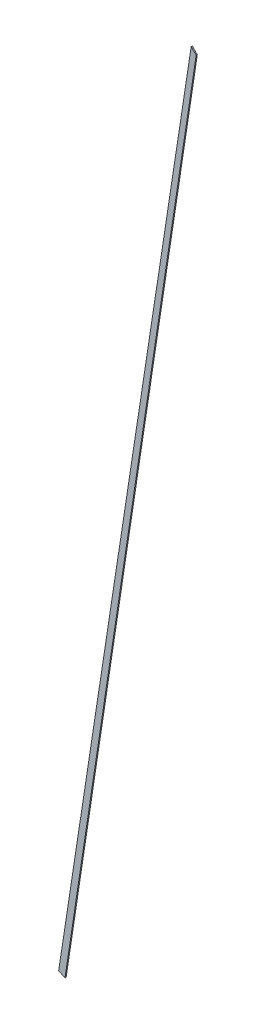
ISO-10303-21;
HEADER;
FILE_DESCRIPTION(('STEP AP214'),'2;1');
FILE_NAME('part.step','',(''),(''),'','','');
FILE_SCHEMA(('AUTOMOTIVE_DESIGN { 1 0 10303 214 1 1 1 1 }'));
ENDSEC;
DATA;
#1=APPLICATION_CONTEXT('core data for automotive mechanical design processes');
#2=APPLICATION_PROTOCOL_DEFINITION('international standard','automotive_design',2000,#1);
#3=PRODUCT_CONTEXT('',#1,'mechanical');
#4=PRODUCT('Part','Part','',(#3));
#5=PRODUCT_RELATED_PRODUCT_CATEGORY('part','',(#4));
#6=PRODUCT_DEFINITION_FORMATION('','',#4);
#7=PRODUCT_DEFINITION_CONTEXT('part definition',#1,'design');
#8=PRODUCT_DEFINITION('design','',#6,#7);
#9=PRODUCT_DEFINITION_SHAPE('','',#8);
#10=(LENGTH_UNIT() NAMED_UNIT(*) SI_UNIT(.MILLI.,.METRE.));
#11=(NAMED_UNIT(*) PLANE_ANGLE_UNIT() SI_UNIT($,.RADIAN.));
#12=(NAMED_UNIT(*) SI_UNIT($,.STERADIAN.) SOLID_ANGLE_UNIT());
#13=UNCERTAINTY_MEASURE_WITH_UNIT(LENGTH_MEASURE(1.E-05),#10,'distance_accuracy_value','');
#14=(GEOMETRIC_REPRESENTATION_CONTEXT(3) GLOBAL_UNCERTAINTY_ASSIGNED_CONTEXT((#13)) GLOBAL_UNIT_ASSIGNED_CONTEXT((#10,
#11,#12)) REPRESENTATION_CONTEXT('',''));
#15=CARTESIAN_POINT('',(0.,0.,0.));
#16=DIRECTION('',(0.,0.,1.));
#17=DIRECTION('',(1.,0.,0.));
#18=AXIS2_PLACEMENT_3D('',#15,#16,#17);
#19=CARTESIAN_POINT('',(917.615369088428,917.615369088428,3.175));
#20=DIRECTION('',(-0.707106781186548,-0.707106781186548,0.));
#21=DIRECTION('',(0.707106781186548,-0.707106781186548,0.));
#22=AXIS2_PLACEMENT_3D('',#19,#20,#21);
#23=PLANE('',#22);
#24=DIRECTION('',(-0.707106781186548,0.707106781186548,0.));
#25=VECTOR('',#24,1.);
#26=CARTESIAN_POINT('',(917.615369088428,917.615369088428,0.));
#27=LINE('',#26,#25);
#28=CARTESIAN_POINT('',(67.2588104402783,1767.97192773658,0.));
#29=VERTEX_POINT('',#28);
#30=CARTESIAN_POINT('',(53.7884262586746,1781.44231191818,0.));
#31=VERTEX_POINT('',#30);
#32=EDGE_CURVE('E98',#29,#31,#27,.T.);
#33=ORIENTED_EDGE('',*,*,#32,.T.);
#34=DIRECTION('',(0.,0.,-1.));
#35=VECTOR('',#34,1.);
#36=CARTESIAN_POINT('',(53.7884262586746,1781.44231191818,3.175));
#37=LINE('',#36,#35);
#38=CARTESIAN_POINT('',(53.7884262586746,1781.44231191818,3.175));
#39=VERTEX_POINT('',#38);
#40=EDGE_CURVE('E11',#39,#31,#37,.T.);
#41=ORIENTED_EDGE('',*,*,#40,.F.);
#42=DIRECTION('',(-0.707106781186548,0.707106781186548,0.));
#43=VECTOR('',#42,1.);
#44=CARTESIAN_POINT('',(917.615369088428,917.615369088428,3.175));
#45=LINE('',#44,#43);
#46=CARTESIAN_POINT('',(67.2588104402783,1767.97192773658,3.175));
#47=VERTEX_POINT('',#46);
#48=EDGE_CURVE('E86',#47,#39,#45,.T.);
#49=ORIENTED_EDGE('',*,*,#48,.F.);
#50=DIRECTION('',(0.,0.,-1.));
#51=VECTOR('',#50,1.);
#52=CARTESIAN_POINT('',(67.2588104402783,1767.97192773658,3.175));
#53=LINE('',#52,#51);
#54=EDGE_CURVE('E94',#47,#29,#53,.T.);
#55=ORIENTED_EDGE('',*,*,#54,.T.);
#56=EDGE_LOOP('',(#33,#41,#49,#55));
#57=FACE_BOUND('',#56,.T.);
#58=ADVANCED_FACE('F35',(#57),#23,.F.);
#59=CARTESIAN_POINT('',(-213.628632397325,32.667406388178,3.175));
#60=DIRECTION('',(0.988509357300365,-0.1511596855303,0.));
#61=DIRECTION('',(0.1511596855303,0.988509357300365,0.));
#62=AXIS2_PLACEMENT_3D('',#59,#60,#61);
#63=PLANE('',#62);
#64=DIRECTION('',(-0.1511596855303,-0.988509357300365,0.));
#65=VECTOR('',#64,1.);
#66=CARTESIAN_POINT('',(-213.628632397325,32.667406388178,0.));
#67=LINE('',#66,#65);
#68=CARTESIAN_POINT('',(-304.535503681059,-561.818435465854,0.));
#69=VERTEX_POINT('',#68);
#70=EDGE_CURVE('E90',#31,#69,#67,.T.);
#71=ORIENTED_EDGE('',*,*,#70,.T.);
#72=DIRECTION('',(0.,0.,-1.));
#73=VECTOR('',#72,1.);
#74=CARTESIAN_POINT('',(-304.535503681059,-561.818435465854,3.175));
#75=LINE('',#74,#73);
#76=CARTESIAN_POINT('',(-304.535503681059,-561.818435465854,3.175));
#77=VERTEX_POINT('',#76);
#78=EDGE_CURVE('E43',#77,#69,#75,.T.);
#79=ORIENTED_EDGE('',*,*,#78,.F.);
#80=DIRECTION('',(-0.1511596855303,-0.988509357300365,0.));
#81=VECTOR('',#80,1.);
#82=CARTESIAN_POINT('',(-213.628632397325,32.667406388178,3.175));
#83=LINE('',#82,#81);
#84=EDGE_CURVE('E81',#39,#77,#83,.T.);
#85=ORIENTED_EDGE('',*,*,#84,.F.);
#86=ORIENTED_EDGE('',*,*,#40,.T.);
#87=EDGE_LOOP('',(#71,#79,#85,#86));
#88=FACE_BOUND('',#87,.T.);
#89=ADVANCED_FACE('F89',(#88),#63,.F.);
#90=CARTESIAN_POINT('',(-284.321387199017,-571.868483346692,3.175));
#91=DIRECTION('',(0.445192120904195,0.895435076085824,0.));
#92=DIRECTION('',(-0.895435076085824,0.445192120904195,0.));
#93=AXIS2_PLACEMENT_3D('',#90,#91,#92);
#94=PLANE('',#93);
#95=DIRECTION('',(0.895435076085824,-0.445192120904195,0.));
#96=VECTOR('',#95,1.);
#97=CARTESIAN_POINT('',(-284.321387199017,-571.868483346692,0.));
#98=LINE('',#97,#96);
#99=CARTESIAN_POINT('',(-287.477465481624,-570.299345369079,0.));
#100=VERTEX_POINT('',#99);
#101=EDGE_CURVE('E68',#69,#100,#98,.T.);
#102=ORIENTED_EDGE('',*,*,#101,.T.);
#103=DIRECTION('',(0.,0.,-1.));
#104=VECTOR('',#103,1.);
#105=CARTESIAN_POINT('',(-287.477465481624,-570.299345369079,3.175));
#106=LINE('',#105,#104);
#107=CARTESIAN_POINT('',(-287.477465481624,-570.299345369079,3.175));
#108=VERTEX_POINT('',#107);
#109=EDGE_CURVE('E91',#108,#100,#106,.T.);
#110=ORIENTED_EDGE('',*,*,#109,.F.);
#111=DIRECTION('',(0.895435076085824,-0.445192120904195,0.));
#112=VECTOR('',#111,1.);
#113=CARTESIAN_POINT('',(-284.321387199017,-571.868483346692,3.175));
#114=LINE('',#113,#112);
#115=EDGE_CURVE('E84',#77,#108,#114,.T.);
#116=ORIENTED_EDGE('',*,*,#115,.F.);
#117=ORIENTED_EDGE('',*,*,#78,.T.);
#118=EDGE_LOOP('',(#102,#110,#116,#117));
#119=FACE_BOUND('',#118,.T.);
#120=ADVANCED_FACE('F92',(#119),#94,.F.);
#121=CARTESIAN_POINT('',(-196.436944157253,29.8012086216457,3.175));
#122=DIRECTION('',(-0.988687132085346,0.149992515976145,0.));
#123=DIRECTION('',(-0.149992515976145,-0.988687132085346,0.));
#124=AXIS2_PLACEMENT_3D('',#121,#122,#123);
#125=PLANE('',#124);
#126=DIRECTION('',(0.149992515976145,0.988687132085346,0.));
#127=VECTOR('',#126,1.);
#128=CARTESIAN_POINT('',(-196.436944157253,29.8012086216457,0.));
#129=LINE('',#128,#127);
#130=EDGE_CURVE('E74',#100,#29,#129,.T.);
#131=ORIENTED_EDGE('',*,*,#130,.T.);
#132=ORIENTED_EDGE('',*,*,#54,.F.);
#133=DIRECTION('',(0.149992515976145,0.988687132085346,0.));
#134=VECTOR('',#133,1.);
#135=CARTESIAN_POINT('',(-196.436944157253,29.8012086216457,3.175));
#136=LINE('',#135,#134);
#137=EDGE_CURVE('E51',#108,#47,#136,.T.);
#138=ORIENTED_EDGE('',*,*,#137,.F.);
#139=ORIENTED_EDGE('',*,*,#109,.T.);
#140=EDGE_LOOP('',(#131,#132,#138,#139));
#141=FACE_BOUND('',#140,.T.);
#142=ADVANCED_FACE('F105',(#141),#125,.F.);
#143=CARTESIAN_POINT('',(0.,0.,3.175));
#144=DIRECTION('',(0.,0.,1.));
#145=DIRECTION('',(1.,0.,0.));
#146=AXIS2_PLACEMENT_3D('',#143,#144,#145);
#147=PLANE('',#146);
#148=ORIENTED_EDGE('',*,*,#48,.T.);
#149=ORIENTED_EDGE('',*,*,#84,.T.);
#150=ORIENTED_EDGE('',*,*,#115,.T.);
#151=ORIENTED_EDGE('',*,*,#137,.T.);
#152=EDGE_LOOP('',(#148,#149,#150,#151));
#153=FACE_BOUND('',#152,.T.);
#154=ADVANCED_FACE('F82',(#153),#147,.T.);
#155=CARTESIAN_POINT('',(0.,0.,0.));
#156=DIRECTION('',(0.,0.,1.));
#157=DIRECTION('',(1.,0.,0.));
#158=AXIS2_PLACEMENT_3D('',#155,#156,#157);
#159=PLANE('',#158);
#160=ORIENTED_EDGE('',*,*,#32,.F.);
#161=ORIENTED_EDGE('',*,*,#130,.F.);
#162=ORIENTED_EDGE('',*,*,#101,.F.);
#163=ORIENTED_EDGE('',*,*,#70,.F.);
#164=EDGE_LOOP('',(#160,#161,#162,#163));
#165=FACE_BOUND('',#164,.T.);
#166=ADVANCED_FACE('F108',(#165),#159,.F.);
#167=CLOSED_SHELL('',(#58,#89,#120,#142,#154,#166));
#168=MANIFOLD_SOLID_BREP('B2',#167);
#169=ADVANCED_BREP_SHAPE_REPRESENTATION('',(#18,#168),#14);
#170=SHAPE_DEFINITION_REPRESENTATION(#9,#169);
ENDSEC;
END-ISO-10303-21;
